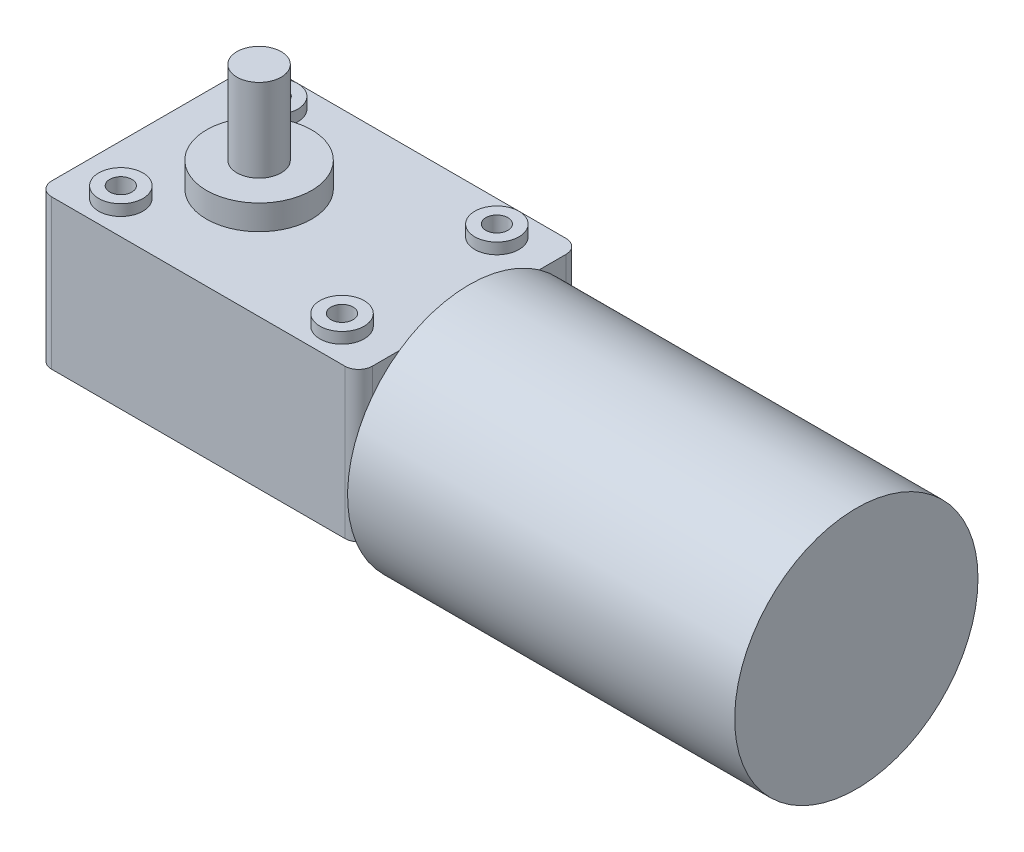
ISO-10303-21;
HEADER;
FILE_DESCRIPTION(('STEP AP214'),'2;1');
FILE_NAME('part.step','',(''),(''),'','','');
FILE_SCHEMA(('AUTOMOTIVE_DESIGN { 1 0 10303 214 1 1 1 1 }'));
ENDSEC;
DATA;
#1=APPLICATION_CONTEXT('core data for automotive mechanical design processes');
#2=APPLICATION_PROTOCOL_DEFINITION('international standard','automotive_design',2000,#1);
#3=PRODUCT_CONTEXT('',#1,'mechanical');
#4=PRODUCT('Part','Part','',(#3));
#5=PRODUCT_RELATED_PRODUCT_CATEGORY('part','',(#4));
#6=PRODUCT_DEFINITION_FORMATION('','',#4);
#7=PRODUCT_DEFINITION_CONTEXT('part definition',#1,'design');
#8=PRODUCT_DEFINITION('design','',#6,#7);
#9=PRODUCT_DEFINITION_SHAPE('','',#8);
#10=(LENGTH_UNIT() NAMED_UNIT(*) SI_UNIT(.MILLI.,.METRE.));
#11=(NAMED_UNIT(*) PLANE_ANGLE_UNIT() SI_UNIT($,.RADIAN.));
#12=(NAMED_UNIT(*) SI_UNIT($,.STERADIAN.) SOLID_ANGLE_UNIT());
#13=UNCERTAINTY_MEASURE_WITH_UNIT(LENGTH_MEASURE(1.E-05),#10,'distance_accuracy_value','');
#14=(GEOMETRIC_REPRESENTATION_CONTEXT(3) GLOBAL_UNCERTAINTY_ASSIGNED_CONTEXT((#13)) GLOBAL_UNIT_ASSIGNED_CONTEXT((#10,
#11,#12)) REPRESENTATION_CONTEXT('',''));
#15=CARTESIAN_POINT('',(0.,0.,0.));
#16=DIRECTION('',(0.,0.,1.));
#17=DIRECTION('',(1.,0.,0.));
#18=AXIS2_PLACEMENT_3D('',#15,#16,#17);
#19=CARTESIAN_POINT('',(-20.,-15.5,14.));
#20=DIRECTION('',(0.,-1.,0.));
#21=DIRECTION('',(0.,0.,1.));
#22=AXIS2_PLACEMENT_3D('',#19,#20,#21);
#23=PLANE('',#22);
#24=CARTESIAN_POINT('',(-20.,-15.5,14.));
#25=DIRECTION('',(0.,1.,0.));
#26=DIRECTION('',(0.,0.,1.));
#27=AXIS2_PLACEMENT_3D('',#24,#25,#26);
#28=CIRCLE('',#27,4.);
#29=CARTESIAN_POINT('',(-20.,-15.5,18.));
#30=VERTEX_POINT('',#29);
#31=EDGE_CURVE('E268',#30,#30,#28,.T.);
#32=ORIENTED_EDGE('',*,*,#31,.F.);
#33=EDGE_LOOP('',(#32));
#34=FACE_BOUND('',#33,.T.);
#35=CARTESIAN_POINT('',(-20.,-15.5,14.));
#36=DIRECTION('',(0.,1.,0.));
#37=DIRECTION('',(0.,0.,1.));
#38=AXIS2_PLACEMENT_3D('',#35,#36,#37);
#39=CIRCLE('',#38,2.);
#40=CARTESIAN_POINT('',(-20.,-15.5,16.));
#41=VERTEX_POINT('',#40);
#42=EDGE_CURVE('E307',#41,#41,#39,.T.);
#43=ORIENTED_EDGE('',*,*,#42,.T.);
#44=EDGE_LOOP('',(#43));
#45=FACE_BOUND('',#44,.T.);
#46=ADVANCED_FACE('F34',(#34,#45),#23,.T.);
#47=CARTESIAN_POINT('',(20.,-15.5,14.));
#48=DIRECTION('',(0.,-1.,0.));
#49=DIRECTION('',(0.,0.,1.));
#50=AXIS2_PLACEMENT_3D('',#47,#48,#49);
#51=PLANE('',#50);
#52=CARTESIAN_POINT('',(20.,-15.5,14.));
#53=DIRECTION('',(0.,1.,0.));
#54=DIRECTION('',(0.,0.,1.));
#55=AXIS2_PLACEMENT_3D('',#52,#53,#54);
#56=CIRCLE('',#55,4.);
#57=CARTESIAN_POINT('',(20.,-15.5,18.));
#58=VERTEX_POINT('',#57);
#59=EDGE_CURVE('E274',#58,#58,#56,.T.);
#60=ORIENTED_EDGE('',*,*,#59,.F.);
#61=EDGE_LOOP('',(#60));
#62=FACE_BOUND('',#61,.T.);
#63=CARTESIAN_POINT('',(20.,-15.5,14.));
#64=DIRECTION('',(0.,1.,0.));
#65=DIRECTION('',(0.,0.,1.));
#66=AXIS2_PLACEMENT_3D('',#63,#64,#65);
#67=CIRCLE('',#66,2.);
#68=CARTESIAN_POINT('',(20.,-15.5,16.));
#69=VERTEX_POINT('',#68);
#70=EDGE_CURVE('E301',#69,#69,#67,.T.);
#71=ORIENTED_EDGE('',*,*,#70,.T.);
#72=EDGE_LOOP('',(#71));
#73=FACE_BOUND('',#72,.T.);
#74=ADVANCED_FACE('F378',(#62,#73),#51,.T.);
#75=CARTESIAN_POINT('',(20.,-15.5,-14.));
#76=DIRECTION('',(0.,-1.,0.));
#77=DIRECTION('',(0.,0.,1.));
#78=AXIS2_PLACEMENT_3D('',#75,#76,#77);
#79=PLANE('',#78);
#80=CARTESIAN_POINT('',(20.,-15.5,-14.));
#81=DIRECTION('',(0.,1.,0.));
#82=DIRECTION('',(0.,0.,1.));
#83=AXIS2_PLACEMENT_3D('',#80,#81,#82);
#84=CIRCLE('',#83,4.);
#85=CARTESIAN_POINT('',(20.,-15.5,-10.));
#86=VERTEX_POINT('',#85);
#87=EDGE_CURVE('E280',#86,#86,#84,.T.);
#88=ORIENTED_EDGE('',*,*,#87,.F.);
#89=EDGE_LOOP('',(#88));
#90=FACE_BOUND('',#89,.T.);
#91=CARTESIAN_POINT('',(20.,-15.5,-14.));
#92=DIRECTION('',(0.,1.,0.));
#93=DIRECTION('',(0.,0.,1.));
#94=AXIS2_PLACEMENT_3D('',#91,#92,#93);
#95=CIRCLE('',#94,2.);
#96=CARTESIAN_POINT('',(20.,-15.5,-12.));
#97=VERTEX_POINT('',#96);
#98=EDGE_CURVE('E295',#97,#97,#95,.T.);
#99=ORIENTED_EDGE('',*,*,#98,.T.);
#100=EDGE_LOOP('',(#99));
#101=FACE_BOUND('',#100,.T.);
#102=ADVANCED_FACE('F384',(#90,#101),#79,.T.);
#103=CARTESIAN_POINT('',(-20.,-15.5,-13.9999999999999));
#104=DIRECTION('',(0.,-1.,0.));
#105=DIRECTION('',(0.,0.,1.));
#106=AXIS2_PLACEMENT_3D('',#103,#104,#105);
#107=PLANE('',#106);
#108=CARTESIAN_POINT('',(-20.,-15.5,-13.9999999999999));
#109=DIRECTION('',(0.,1.,0.));
#110=DIRECTION('',(0.,0.,1.));
#111=AXIS2_PLACEMENT_3D('',#108,#109,#110);
#112=CIRCLE('',#111,4.);
#113=CARTESIAN_POINT('',(-20.,-15.5,-9.9999999999999));
#114=VERTEX_POINT('',#113);
#115=EDGE_CURVE('E267',#114,#114,#112,.T.);
#116=ORIENTED_EDGE('',*,*,#115,.F.);
#117=EDGE_LOOP('',(#116));
#118=FACE_BOUND('',#117,.T.);
#119=CARTESIAN_POINT('',(-20.,-15.5,-13.9999999999999));
#120=DIRECTION('',(0.,1.,0.));
#121=DIRECTION('',(0.,0.,1.));
#122=AXIS2_PLACEMENT_3D('',#119,#120,#121);
#123=CIRCLE('',#122,2.);
#124=CARTESIAN_POINT('',(-20.,-15.5,-11.9999999999999));
#125=VERTEX_POINT('',#124);
#126=EDGE_CURVE('E289',#125,#125,#123,.T.);
#127=ORIENTED_EDGE('',*,*,#126,.T.);
#128=EDGE_LOOP('',(#127));
#129=FACE_BOUND('',#128,.T.);
#130=ADVANCED_FACE('F390',(#118,#129),#107,.T.);
#131=CARTESIAN_POINT('',(29.,13.5,17.5));
#132=DIRECTION('',(-1.,0.,0.));
#133=DIRECTION('',(0.,0.,1.));
#134=AXIS2_PLACEMENT_3D('',#131,#132,#133);
#135=PLANE('',#134);
#136=CARTESIAN_POINT('',(29.,-4.49999999999995,0.));
#137=DIRECTION('',(1.,0.,0.));
#138=DIRECTION('',(0.,0.,-1.));
#139=AXIS2_PLACEMENT_3D('',#136,#137,#138);
#140=CIRCLE('',#139,22.);
#141=CARTESIAN_POINT('',(29.,8.83229162597343,-17.5));
#142=VERTEX_POINT('',#141);
#143=CARTESIAN_POINT('',(29.,13.5,-12.6491106406736));
#144=VERTEX_POINT('',#143);
#145=EDGE_CURVE('E257',#142,#144,#140,.T.);
#146=ORIENTED_EDGE('',*,*,#145,.F.);
#147=DIRECTION('',(0.,-1.,0.));
#148=VECTOR('',#147,1.);
#149=CARTESIAN_POINT('',(29.,13.5,-17.5));
#150=LINE('',#149,#148);
#151=CARTESIAN_POINT('',(29.,13.5,-17.5));
#152=VERTEX_POINT('',#151);
#153=EDGE_CURVE('E130',#152,#142,#150,.T.);
#154=ORIENTED_EDGE('',*,*,#153,.F.);
#155=DIRECTION('',(0.,0.,-1.));
#156=VECTOR('',#155,1.);
#157=CARTESIAN_POINT('',(29.,13.5,17.5));
#158=LINE('',#157,#156);
#159=EDGE_CURVE('E57',#144,#152,#158,.T.);
#160=ORIENTED_EDGE('',*,*,#159,.F.);
#161=EDGE_LOOP('',(#146,#154,#160));
#162=FACE_BOUND('',#161,.T.);
#163=ADVANCED_FACE('F392',(#162),#135,.F.);
#164=CARTESIAN_POINT('',(29.,13.5,12.6491106406736));
#165=VERTEX_POINT('',#164);
#166=CARTESIAN_POINT('',(29.,8.83229162597343,17.5));
#167=VERTEX_POINT('',#166);
#168=EDGE_CURVE('E870',#165,#167,#140,.T.);
#169=ORIENTED_EDGE('',*,*,#168,.F.);
#170=CARTESIAN_POINT('',(29.,13.5,17.5));
#171=VERTEX_POINT('',#170);
#172=EDGE_CURVE('E192',#171,#165,#158,.T.);
#173=ORIENTED_EDGE('',*,*,#172,.F.);
#174=DIRECTION('',(0.,-1.,0.));
#175=VECTOR('',#174,1.);
#176=CARTESIAN_POINT('',(29.,13.5,17.5));
#177=LINE('',#176,#175);
#178=EDGE_CURVE('E162',#171,#167,#177,.T.);
#179=ORIENTED_EDGE('',*,*,#178,.T.);
#180=EDGE_LOOP('',(#169,#173,#179));
#181=FACE_BOUND('',#180,.T.);
#182=ADVANCED_FACE('F398',(#181),#135,.F.);
#183=CARTESIAN_POINT('',(-9.00000000000001,18.,0.));
#184=DIRECTION('',(0.,1.,0.));
#185=DIRECTION('',(0.,0.,1.));
#186=AXIS2_PLACEMENT_3D('',#183,#184,#185);
#187=PLANE('',#186);
#188=CARTESIAN_POINT('',(-9.00000000000001,18.,0.));
#189=DIRECTION('',(0.,1.,0.));
#190=DIRECTION('',(0.,0.,1.));
#191=AXIS2_PLACEMENT_3D('',#188,#189,#190);
#192=CIRCLE('',#191,9.5);
#193=CARTESIAN_POINT('',(-9.00000000000001,18.,9.5));
#194=VERTEX_POINT('',#193);
#195=EDGE_CURVE('E240',#194,#194,#192,.T.);
#196=ORIENTED_EDGE('',*,*,#195,.T.);
#197=EDGE_LOOP('',(#196));
#198=FACE_BOUND('',#197,.T.);
#199=CARTESIAN_POINT('',(-9.00000000000001,18.,0.));
#200=DIRECTION('',(0.,1.,0.));
#201=DIRECTION('',(0.,0.,1.));
#202=AXIS2_PLACEMENT_3D('',#199,#200,#201);
#203=CIRCLE('',#202,4.);
#204=CARTESIAN_POINT('',(-9.00000000000001,18.,4.));
#205=VERTEX_POINT('',#204);
#206=EDGE_CURVE('E249',#205,#205,#203,.T.);
#207=ORIENTED_EDGE('',*,*,#206,.F.);
#208=EDGE_LOOP('',(#207));
#209=FACE_BOUND('',#208,.T.);
#210=ADVANCED_FACE('F610',(#198,#209),#187,.T.);
#211=CARTESIAN_POINT('',(-26.5,13.5,17.5));
#212=DIRECTION('',(0.,1.,0.));
#213=DIRECTION('',(0.,0.,1.));
#214=AXIS2_PLACEMENT_3D('',#211,#212,#213);
#215=PLANE('',#214);
#216=CARTESIAN_POINT('',(20.,13.5,-14.));
#217=DIRECTION('',(0.,1.,0.));
#218=DIRECTION('',(0.,0.,1.));
#219=AXIS2_PLACEMENT_3D('',#216,#217,#218);
#220=CIRCLE('',#219,4.);
#221=CARTESIAN_POINT('',(20.,13.5,-10.));
#222=VERTEX_POINT('',#221);
#223=EDGE_CURVE('E213',#222,#222,#220,.T.);
#224=ORIENTED_EDGE('',*,*,#223,.F.);
#225=EDGE_LOOP('',(#224));
#226=FACE_BOUND('',#225,.T.);
#227=CARTESIAN_POINT('',(-20.,13.5,14.));
#228=DIRECTION('',(0.,1.,0.));
#229=DIRECTION('',(0.,0.,1.));
#230=AXIS2_PLACEMENT_3D('',#227,#228,#229);
#231=CIRCLE('',#230,4.);
#232=CARTESIAN_POINT('',(-20.,13.5,18.));
#233=VERTEX_POINT('',#232);
#234=EDGE_CURVE('E201',#233,#233,#231,.T.);
#235=ORIENTED_EDGE('',*,*,#234,.F.);
#236=EDGE_LOOP('',(#235));
#237=FACE_BOUND('',#236,.T.);
#238=CARTESIAN_POINT('',(-26.5,13.5,17.5));
#239=DIRECTION('',(0.,1.,0.));
#240=DIRECTION('',(0.,0.,1.));
#241=AXIS2_PLACEMENT_3D('',#238,#239,#240);
#242=CIRCLE('',#241,2.5);
#243=CARTESIAN_POINT('',(-29.,13.5,17.5));
#244=VERTEX_POINT('',#243);
#245=CARTESIAN_POINT('',(-26.5,13.5,20.));
#246=VERTEX_POINT('',#245);
#247=EDGE_CURVE('E148',#244,#246,#242,.T.);
#248=ORIENTED_EDGE('',*,*,#247,.T.);
#249=DIRECTION('',(1.,0.,0.));
#250=VECTOR('',#249,1.);
#251=CARTESIAN_POINT('',(-26.5,13.5,20.));
#252=LINE('',#251,#250);
#253=CARTESIAN_POINT('',(26.5,13.5,20.));
#254=VERTEX_POINT('',#253);
#255=EDGE_CURVE('E174',#246,#254,#252,.T.);
#256=ORIENTED_EDGE('',*,*,#255,.T.);
#257=CARTESIAN_POINT('',(26.5,13.5,17.5));
#258=DIRECTION('',(0.,1.,0.));
#259=DIRECTION('',(0.,0.,1.));
#260=AXIS2_PLACEMENT_3D('',#257,#258,#259);
#261=CIRCLE('',#260,2.5);
#262=EDGE_CURVE('E167',#254,#171,#261,.T.);
#263=ORIENTED_EDGE('',*,*,#262,.T.);
#264=ORIENTED_EDGE('',*,*,#172,.T.);
#265=DIRECTION('',(0.,0.,-1.));
#266=VECTOR('',#265,1.);
#267=CARTESIAN_POINT('',(29.,13.5,17.5));
#268=LINE('',#267,#266);
#269=EDGE_CURVE('E252',#165,#144,#268,.T.);
#270=ORIENTED_EDGE('',*,*,#269,.T.);
#271=ORIENTED_EDGE('',*,*,#159,.T.);
#272=CARTESIAN_POINT('',(26.5,13.5,-17.5));
#273=DIRECTION('',(0.,1.,0.));
#274=DIRECTION('',(0.,0.,1.));
#275=AXIS2_PLACEMENT_3D('',#272,#273,#274);
#276=CIRCLE('',#275,2.49999999999999);
#277=CARTESIAN_POINT('',(26.5,13.5,-20.));
#278=VERTEX_POINT('',#277);
#279=EDGE_CURVE('E190',#152,#278,#276,.T.);
#280=ORIENTED_EDGE('',*,*,#279,.T.);
#281=DIRECTION('',(-1.,0.,0.));
#282=VECTOR('',#281,1.);
#283=CARTESIAN_POINT('',(-26.5,13.5,-20.));
#284=LINE('',#283,#282);
#285=CARTESIAN_POINT('',(-26.5,13.5,-20.));
#286=VERTEX_POINT('',#285);
#287=EDGE_CURVE('E188',#278,#286,#284,.T.);
#288=ORIENTED_EDGE('',*,*,#287,.T.);
#289=CARTESIAN_POINT('',(-26.5,13.5,-17.5));
#290=DIRECTION('',(0.,1.,0.));
#291=DIRECTION('',(0.,0.,-1.));
#292=AXIS2_PLACEMENT_3D('',#289,#290,#291);
#293=CIRCLE('',#292,2.5);
#294=CARTESIAN_POINT('',(-29.,13.5,-17.5));
#295=VERTEX_POINT('',#294);
#296=EDGE_CURVE('E186',#286,#295,#293,.T.);
#297=ORIENTED_EDGE('',*,*,#296,.T.);
#298=DIRECTION('',(0.,0.,1.));
#299=VECTOR('',#298,1.);
#300=CARTESIAN_POINT('',(-29.,13.5,17.5));
#301=LINE('',#300,#299);
#302=EDGE_CURVE('E153',#295,#244,#301,.T.);
#303=ORIENTED_EDGE('',*,*,#302,.T.);
#304=EDGE_LOOP('',(#248,#256,#263,#264,#270,#271,#280,#288,#297,#303));
#305=FACE_BOUND('',#304,.T.);
#306=CARTESIAN_POINT('',(-20.,13.5,-13.9999999999999));
#307=DIRECTION('',(0.,1.,0.));
#308=DIRECTION('',(0.,0.,1.));
#309=AXIS2_PLACEMENT_3D('',#306,#307,#308);
#310=CIRCLE('',#309,4.);
#311=CARTESIAN_POINT('',(-20.,13.5,-9.9999999999999));
#312=VERTEX_POINT('',#311);
#313=EDGE_CURVE('E182',#312,#312,#310,.T.);
#314=ORIENTED_EDGE('',*,*,#313,.F.);
#315=EDGE_LOOP('',(#314));
#316=FACE_BOUND('',#315,.T.);
#317=CARTESIAN_POINT('',(20.,13.5,14.));
#318=DIRECTION('',(0.,1.,0.));
#319=DIRECTION('',(0.,0.,1.));
#320=AXIS2_PLACEMENT_3D('',#317,#318,#319);
#321=CIRCLE('',#320,4.);
#322=CARTESIAN_POINT('',(20.,13.5,18.));
#323=VERTEX_POINT('',#322);
#324=EDGE_CURVE('E207',#323,#323,#321,.T.);
#325=ORIENTED_EDGE('',*,*,#324,.F.);
#326=EDGE_LOOP('',(#325));
#327=FACE_BOUND('',#326,.T.);
#328=CARTESIAN_POINT('',(-9.00000000000001,13.5,0.));
#329=DIRECTION('',(0.,1.,0.));
#330=DIRECTION('',(0.,0.,1.));
#331=AXIS2_PLACEMENT_3D('',#328,#329,#330);
#332=CIRCLE('',#331,9.5);
#333=CARTESIAN_POINT('',(-9.00000000000001,13.5,9.5));
#334=VERTEX_POINT('',#333);
#335=EDGE_CURVE('E243',#334,#334,#332,.T.);
#336=ORIENTED_EDGE('',*,*,#335,.F.);
#337=EDGE_LOOP('',(#336));
#338=FACE_BOUND('',#337,.T.);
#339=ADVANCED_FACE('F605',(#226,#237,#305,#316,#327,#338),#215,.T.);
#340=CARTESIAN_POINT('',(-26.5,13.5,17.5));
#341=DIRECTION('',(0.,-1.,0.));
#342=DIRECTION('',(0.,0.,-1.));
#343=AXIS2_PLACEMENT_3D('',#340,#341,#342);
#344=CYLINDRICAL_SURFACE('',#343,2.5);
#345=CARTESIAN_POINT('',(-26.5,-13.5,17.5));
#346=DIRECTION('',(0.,1.,0.));
#347=DIRECTION('',(0.,0.,1.));
#348=AXIS2_PLACEMENT_3D('',#345,#346,#347);
#349=CIRCLE('',#348,2.5);
#350=CARTESIAN_POINT('',(-29.,-13.5,17.5));
#351=VERTEX_POINT('',#350);
#352=CARTESIAN_POINT('',(-26.5,-13.5,20.));
#353=VERTEX_POINT('',#352);
#354=EDGE_CURVE('E171',#351,#353,#349,.T.);
#355=ORIENTED_EDGE('',*,*,#354,.T.);
#356=DIRECTION('',(0.,-1.,0.));
#357=VECTOR('',#356,1.);
#358=CARTESIAN_POINT('',(-26.5,13.5,20.));
#359=LINE('',#358,#357);
#360=EDGE_CURVE('E11',#246,#353,#359,.T.);
#361=ORIENTED_EDGE('',*,*,#360,.F.);
#362=ORIENTED_EDGE('',*,*,#247,.F.);
#363=DIRECTION('',(0.,-1.,0.));
#364=VECTOR('',#363,1.);
#365=CARTESIAN_POINT('',(-29.,13.5,17.5));
#366=LINE('',#365,#364);
#367=EDGE_CURVE('E149',#244,#351,#366,.T.);
#368=ORIENTED_EDGE('',*,*,#367,.T.);
#369=EDGE_LOOP('',(#355,#361,#362,#368));
#370=FACE_BOUND('',#369,.T.);
#371=ADVANCED_FACE('F36',(#370),#344,.T.);
#372=CARTESIAN_POINT('',(-26.5,13.5,20.));
#373=DIRECTION('',(0.,0.,-1.));
#374=DIRECTION('',(-1.,0.,0.));
#375=AXIS2_PLACEMENT_3D('',#372,#373,#374);
#376=PLANE('',#375);
#377=DIRECTION('',(1.,0.,0.));
#378=VECTOR('',#377,1.);
#379=CARTESIAN_POINT('',(-26.5,-13.5,20.));
#380=LINE('',#379,#378);
#381=CARTESIAN_POINT('',(26.5,-13.5,20.));
#382=VERTEX_POINT('',#381);
#383=EDGE_CURVE('E139',#353,#382,#380,.T.);
#384=ORIENTED_EDGE('',*,*,#383,.T.);
#385=DIRECTION('',(0.,-1.,0.));
#386=VECTOR('',#385,1.);
#387=CARTESIAN_POINT('',(26.5,13.5,20.));
#388=LINE('',#387,#386);
#389=EDGE_CURVE('E42',#254,#382,#388,.T.);
#390=ORIENTED_EDGE('',*,*,#389,.F.);
#391=ORIENTED_EDGE('',*,*,#255,.F.);
#392=ORIENTED_EDGE('',*,*,#360,.T.);
#393=EDGE_LOOP('',(#384,#390,#391,#392));
#394=FACE_BOUND('',#393,.T.);
#395=ADVANCED_FACE('F173',(#394),#376,.F.);
#396=CARTESIAN_POINT('',(26.5,13.5,17.5));
#397=DIRECTION('',(0.,-1.,0.));
#398=DIRECTION('',(0.,0.,-1.));
#399=AXIS2_PLACEMENT_3D('',#396,#397,#398);
#400=CYLINDRICAL_SURFACE('',#399,2.5);
#401=CARTESIAN_POINT('',(26.5,-13.5,17.5));
#402=DIRECTION('',(0.,1.,0.));
#403=DIRECTION('',(0.,0.,1.));
#404=AXIS2_PLACEMENT_3D('',#401,#402,#403);
#405=CIRCLE('',#404,2.5);
#406=CARTESIAN_POINT('',(29.,-13.5,17.5));
#407=VERTEX_POINT('',#406);
#408=EDGE_CURVE('E137',#382,#407,#405,.T.);
#409=ORIENTED_EDGE('',*,*,#408,.T.);
#410=DIRECTION('',(0.,-1.,0.));
#411=VECTOR('',#410,1.);
#412=CARTESIAN_POINT('',(29.,13.5,17.5));
#413=LINE('',#412,#411);
#414=EDGE_CURVE('E49',#167,#407,#413,.T.);
#415=ORIENTED_EDGE('',*,*,#414,.F.);
#416=ORIENTED_EDGE('',*,*,#178,.F.);
#417=ORIENTED_EDGE('',*,*,#262,.F.);
#418=ORIENTED_EDGE('',*,*,#389,.T.);
#419=EDGE_LOOP('',(#409,#415,#416,#417,#418));
#420=FACE_BOUND('',#419,.T.);
#421=ADVANCED_FACE('F166',(#420),#400,.T.);
#422=CARTESIAN_POINT('',(26.5,13.5,-17.5));
#423=DIRECTION('',(0.,-1.,0.));
#424=DIRECTION('',(0.,0.,-1.));
#425=AXIS2_PLACEMENT_3D('',#422,#423,#424);
#426=CYLINDRICAL_SURFACE('',#425,2.49999999999999);
#427=CARTESIAN_POINT('',(26.5,-13.5,-17.5));
#428=DIRECTION('',(0.,1.,0.));
#429=DIRECTION('',(0.,0.,1.));
#430=AXIS2_PLACEMENT_3D('',#427,#428,#429);
#431=CIRCLE('',#430,2.49999999999999);
#432=CARTESIAN_POINT('',(29.,-13.5,-17.5));
#433=VERTEX_POINT('',#432);
#434=CARTESIAN_POINT('',(26.5,-13.5,-20.));
#435=VERTEX_POINT('',#434);
#436=EDGE_CURVE('E112',#433,#435,#431,.T.);
#437=ORIENTED_EDGE('',*,*,#436,.T.);
#438=DIRECTION('',(0.,-1.,0.));
#439=VECTOR('',#438,1.);
#440=CARTESIAN_POINT('',(26.5,13.5,-20.));
#441=LINE('',#440,#439);
#442=EDGE_CURVE('E159',#278,#435,#441,.T.);
#443=ORIENTED_EDGE('',*,*,#442,.F.);
#444=ORIENTED_EDGE('',*,*,#279,.F.);
#445=ORIENTED_EDGE('',*,*,#153,.T.);
#446=DIRECTION('',(0.,-1.,0.));
#447=VECTOR('',#446,1.);
#448=CARTESIAN_POINT('',(29.,13.5,-17.5));
#449=LINE('',#448,#447);
#450=EDGE_CURVE('E127',#142,#433,#449,.T.);
#451=ORIENTED_EDGE('',*,*,#450,.T.);
#452=EDGE_LOOP('',(#437,#443,#444,#445,#451));
#453=FACE_BOUND('',#452,.T.);
#454=ADVANCED_FACE('F128',(#453),#426,.T.);
#455=CARTESIAN_POINT('',(-26.5,13.5,-20.));
#456=DIRECTION('',(0.,0.,1.));
#457=DIRECTION('',(1.,0.,0.));
#458=AXIS2_PLACEMENT_3D('',#455,#456,#457);
#459=PLANE('',#458);
#460=DIRECTION('',(-1.,0.,0.));
#461=VECTOR('',#460,1.);
#462=CARTESIAN_POINT('',(-26.5,-13.5,-20.));
#463=LINE('',#462,#461);
#464=CARTESIAN_POINT('',(-26.5,-13.5,-20.));
#465=VERTEX_POINT('',#464);
#466=EDGE_CURVE('E120',#435,#465,#463,.T.);
#467=ORIENTED_EDGE('',*,*,#466,.T.);
#468=DIRECTION('',(0.,-1.,0.));
#469=VECTOR('',#468,1.);
#470=CARTESIAN_POINT('',(-26.5,13.5,-20.));
#471=LINE('',#470,#469);
#472=EDGE_CURVE('E156',#286,#465,#471,.T.);
#473=ORIENTED_EDGE('',*,*,#472,.F.);
#474=ORIENTED_EDGE('',*,*,#287,.F.);
#475=ORIENTED_EDGE('',*,*,#442,.T.);
#476=EDGE_LOOP('',(#467,#473,#474,#475));
#477=FACE_BOUND('',#476,.T.);
#478=ADVANCED_FACE('F588',(#477),#459,.F.);
#479=CARTESIAN_POINT('',(-26.5,13.5,-17.5));
#480=DIRECTION('',(0.,-1.,0.));
#481=DIRECTION('',(0.,0.,-1.));
#482=AXIS2_PLACEMENT_3D('',#479,#480,#481);
#483=CYLINDRICAL_SURFACE('',#482,2.5);
#484=CARTESIAN_POINT('',(-26.5,-13.5,-17.5));
#485=DIRECTION('',(0.,1.,0.));
#486=DIRECTION('',(0.,0.,-1.));
#487=AXIS2_PLACEMENT_3D('',#484,#485,#486);
#488=CIRCLE('',#487,2.5);
#489=CARTESIAN_POINT('',(-29.,-13.5,-17.5));
#490=VERTEX_POINT('',#489);
#491=EDGE_CURVE('E144',#465,#490,#488,.T.);
#492=ORIENTED_EDGE('',*,*,#491,.T.);
#493=DIRECTION('',(0.,-1.,0.));
#494=VECTOR('',#493,1.);
#495=CARTESIAN_POINT('',(-29.,13.5,-17.5));
#496=LINE('',#495,#494);
#497=EDGE_CURVE('E152',#295,#490,#496,.T.);
#498=ORIENTED_EDGE('',*,*,#497,.F.);
#499=ORIENTED_EDGE('',*,*,#296,.F.);
#500=ORIENTED_EDGE('',*,*,#472,.T.);
#501=EDGE_LOOP('',(#492,#498,#499,#500));
#502=FACE_BOUND('',#501,.T.);
#503=ADVANCED_FACE('F826',(#502),#483,.T.);
#504=CARTESIAN_POINT('',(-29.,13.5,17.5));
#505=DIRECTION('',(1.,0.,0.));
#506=DIRECTION('',(0.,0.,-1.));
#507=AXIS2_PLACEMENT_3D('',#504,#505,#506);
#508=PLANE('',#507);
#509=DIRECTION('',(0.,0.,1.));
#510=VECTOR('',#509,1.);
#511=CARTESIAN_POINT('',(-29.,-13.5,17.5));
#512=LINE('',#511,#510);
#513=EDGE_CURVE('E146',#490,#351,#512,.T.);
#514=ORIENTED_EDGE('',*,*,#513,.T.);
#515=ORIENTED_EDGE('',*,*,#367,.F.);
#516=ORIENTED_EDGE('',*,*,#302,.F.);
#517=ORIENTED_EDGE('',*,*,#497,.T.);
#518=EDGE_LOOP('',(#514,#515,#516,#517));
#519=FACE_BOUND('',#518,.T.);
#520=ADVANCED_FACE('F349',(#519),#508,.F.);
#521=CARTESIAN_POINT('',(-26.5,-13.5,17.5));
#522=DIRECTION('',(0.,1.,0.));
#523=DIRECTION('',(0.,0.,1.));
#524=AXIS2_PLACEMENT_3D('',#521,#522,#523);
#525=PLANE('',#524);
#526=CARTESIAN_POINT('',(-9.00000000000001,-13.5,0.));
#527=DIRECTION('',(0.,1.,0.));
#528=DIRECTION('',(0.,0.,1.));
#529=AXIS2_PLACEMENT_3D('',#526,#527,#528);
#530=CIRCLE('',#529,9.5);
#531=CARTESIAN_POINT('',(-9.00000000000001,-13.5,9.5));
#532=VERTEX_POINT('',#531);
#533=EDGE_CURVE('E313',#532,#532,#530,.T.);
#534=ORIENTED_EDGE('',*,*,#533,.T.);
#535=EDGE_LOOP('',(#534));
#536=FACE_BOUND('',#535,.T.);
#537=CARTESIAN_POINT('',(20.,-13.5,-14.));
#538=DIRECTION('',(0.,1.,0.));
#539=DIRECTION('',(0.,0.,1.));
#540=AXIS2_PLACEMENT_3D('',#537,#538,#539);
#541=CIRCLE('',#540,4.);
#542=CARTESIAN_POINT('',(20.,-13.5,-10.));
#543=VERTEX_POINT('',#542);
#544=EDGE_CURVE('E283',#543,#543,#541,.T.);
#545=ORIENTED_EDGE('',*,*,#544,.T.);
#546=EDGE_LOOP('',(#545));
#547=FACE_BOUND('',#546,.T.);
#548=CARTESIAN_POINT('',(20.,-13.5,14.));
#549=DIRECTION('',(0.,1.,0.));
#550=DIRECTION('',(0.,0.,1.));
#551=AXIS2_PLACEMENT_3D('',#548,#549,#550);
#552=CIRCLE('',#551,4.);
#553=CARTESIAN_POINT('',(20.,-13.5,18.));
#554=VERTEX_POINT('',#553);
#555=EDGE_CURVE('E277',#554,#554,#552,.T.);
#556=ORIENTED_EDGE('',*,*,#555,.T.);
#557=EDGE_LOOP('',(#556));
#558=FACE_BOUND('',#557,.T.);
#559=CARTESIAN_POINT('',(-20.,-13.5,14.));
#560=DIRECTION('',(0.,1.,0.));
#561=DIRECTION('',(0.,0.,1.));
#562=AXIS2_PLACEMENT_3D('',#559,#560,#561);
#563=CIRCLE('',#562,4.);
#564=CARTESIAN_POINT('',(-20.,-13.5,18.));
#565=VERTEX_POINT('',#564);
#566=EDGE_CURVE('E271',#565,#565,#563,.T.);
#567=ORIENTED_EDGE('',*,*,#566,.T.);
#568=EDGE_LOOP('',(#567));
#569=FACE_BOUND('',#568,.T.);
#570=CARTESIAN_POINT('',(-20.,-13.5,-13.9999999999999));
#571=DIRECTION('',(0.,1.,0.));
#572=DIRECTION('',(0.,0.,1.));
#573=AXIS2_PLACEMENT_3D('',#570,#571,#572);
#574=CIRCLE('',#573,4.);
#575=CARTESIAN_POINT('',(-20.,-13.5,-9.9999999999999));
#576=VERTEX_POINT('',#575);
#577=EDGE_CURVE('E264',#576,#576,#574,.T.);
#578=ORIENTED_EDGE('',*,*,#577,.T.);
#579=EDGE_LOOP('',(#578));
#580=FACE_BOUND('',#579,.T.);
#581=ORIENTED_EDGE('',*,*,#354,.F.);
#582=ORIENTED_EDGE('',*,*,#513,.F.);
#583=ORIENTED_EDGE('',*,*,#491,.F.);
#584=ORIENTED_EDGE('',*,*,#466,.F.);
#585=ORIENTED_EDGE('',*,*,#436,.F.);
#586=DIRECTION('',(0.,0.,-1.));
#587=VECTOR('',#586,1.);
#588=CARTESIAN_POINT('',(29.,-13.5,17.5));
#589=LINE('',#588,#587);
#590=EDGE_CURVE('E118',#407,#433,#589,.T.);
#591=ORIENTED_EDGE('',*,*,#590,.F.);
#592=ORIENTED_EDGE('',*,*,#408,.F.);
#593=ORIENTED_EDGE('',*,*,#383,.F.);
#594=EDGE_LOOP('',(#581,#582,#583,#584,#585,#591,#592,#593));
#595=FACE_BOUND('',#594,.T.);
#596=ADVANCED_FACE('F115',(#536,#547,#558,#569,#580,#595),#525,.F.);
#597=CARTESIAN_POINT('',(-20.,15.5,-13.9999999999999));
#598=DIRECTION('',(0.,-1.,0.));
#599=DIRECTION('',(0.,0.,-1.));
#600=AXIS2_PLACEMENT_3D('',#597,#598,#599);
#601=CYLINDRICAL_SURFACE('',#600,4.);
#602=CARTESIAN_POINT('',(-20.,15.5,-13.9999999999999));
#603=DIRECTION('',(0.,1.,0.));
#604=DIRECTION('',(0.,0.,1.));
#605=AXIS2_PLACEMENT_3D('',#602,#603,#604);
#606=CIRCLE('',#605,4.);
#607=CARTESIAN_POINT('',(-20.,15.5,-9.9999999999999));
#608=VERTEX_POINT('',#607);
#609=EDGE_CURVE('E179',#608,#608,#606,.T.);
#610=ORIENTED_EDGE('',*,*,#609,.F.);
#611=EDGE_LOOP('',(#610));
#612=FACE_BOUND('',#611,.T.);
#613=ORIENTED_EDGE('',*,*,#313,.T.);
#614=EDGE_LOOP('',(#613));
#615=FACE_BOUND('',#614,.T.);
#616=ADVANCED_FACE('F348',(#612,#615),#601,.T.);
#617=CARTESIAN_POINT('',(-20.,15.5,-13.9999999999999));
#618=DIRECTION('',(0.,1.,0.));
#619=DIRECTION('',(0.,0.,1.));
#620=AXIS2_PLACEMENT_3D('',#617,#618,#619);
#621=PLANE('',#620);
#622=CARTESIAN_POINT('',(-20.,15.5,-13.9999999999999));
#623=DIRECTION('',(0.,1.,0.));
#624=DIRECTION('',(0.,0.,1.));
#625=AXIS2_PLACEMENT_3D('',#622,#623,#624);
#626=CIRCLE('',#625,2.);
#627=CARTESIAN_POINT('',(-20.,15.5,-11.9999999999999));
#628=VERTEX_POINT('',#627);
#629=EDGE_CURVE('E219',#628,#628,#626,.T.);
#630=ORIENTED_EDGE('',*,*,#629,.F.);
#631=EDGE_LOOP('',(#630));
#632=FACE_BOUND('',#631,.T.);
#633=ORIENTED_EDGE('',*,*,#609,.T.);
#634=EDGE_LOOP('',(#633));
#635=FACE_BOUND('',#634,.T.);
#636=ADVANCED_FACE('F786',(#632,#635),#621,.T.);
#637=CARTESIAN_POINT('',(-20.,15.5,14.));
#638=DIRECTION('',(0.,-1.,0.));
#639=DIRECTION('',(0.,0.,-1.));
#640=AXIS2_PLACEMENT_3D('',#637,#638,#639);
#641=CYLINDRICAL_SURFACE('',#640,4.);
#642=CARTESIAN_POINT('',(-20.,15.5,14.));
#643=DIRECTION('',(0.,1.,0.));
#644=DIRECTION('',(0.,0.,1.));
#645=AXIS2_PLACEMENT_3D('',#642,#643,#644);
#646=CIRCLE('',#645,4.);
#647=CARTESIAN_POINT('',(-20.,15.5,18.));
#648=VERTEX_POINT('',#647);
#649=EDGE_CURVE('E199',#648,#648,#646,.T.);
#650=ORIENTED_EDGE('',*,*,#649,.F.);
#651=EDGE_LOOP('',(#650));
#652=FACE_BOUND('',#651,.T.);
#653=ORIENTED_EDGE('',*,*,#234,.T.);
#654=EDGE_LOOP('',(#653));
#655=FACE_BOUND('',#654,.T.);
#656=ADVANCED_FACE('F778',(#652,#655),#641,.T.);
#657=CARTESIAN_POINT('',(-20.,15.5,14.));
#658=DIRECTION('',(0.,1.,0.));
#659=DIRECTION('',(0.,0.,1.));
#660=AXIS2_PLACEMENT_3D('',#657,#658,#659);
#661=PLANE('',#660);
#662=CARTESIAN_POINT('',(-20.,15.5,14.));
#663=DIRECTION('',(0.,1.,0.));
#664=DIRECTION('',(0.,0.,1.));
#665=AXIS2_PLACEMENT_3D('',#662,#663,#664);
#666=CIRCLE('',#665,2.);
#667=CARTESIAN_POINT('',(-20.,15.5,16.));
#668=VERTEX_POINT('',#667);
#669=EDGE_CURVE('E237',#668,#668,#666,.T.);
#670=ORIENTED_EDGE('',*,*,#669,.F.);
#671=EDGE_LOOP('',(#670));
#672=FACE_BOUND('',#671,.T.);
#673=ORIENTED_EDGE('',*,*,#649,.T.);
#674=EDGE_LOOP('',(#673));
#675=FACE_BOUND('',#674,.T.);
#676=ADVANCED_FACE('F773',(#672,#675),#661,.T.);
#677=CARTESIAN_POINT('',(20.,15.5,14.));
#678=DIRECTION('',(0.,-1.,0.));
#679=DIRECTION('',(0.,0.,-1.));
#680=AXIS2_PLACEMENT_3D('',#677,#678,#679);
#681=CYLINDRICAL_SURFACE('',#680,4.);
#682=CARTESIAN_POINT('',(20.,15.5,14.));
#683=DIRECTION('',(0.,1.,0.));
#684=DIRECTION('',(0.,0.,1.));
#685=AXIS2_PLACEMENT_3D('',#682,#683,#684);
#686=CIRCLE('',#685,4.);
#687=CARTESIAN_POINT('',(20.,15.5,18.));
#688=VERTEX_POINT('',#687);
#689=EDGE_CURVE('E204',#688,#688,#686,.T.);
#690=ORIENTED_EDGE('',*,*,#689,.F.);
#691=EDGE_LOOP('',(#690));
#692=FACE_BOUND('',#691,.T.);
#693=ORIENTED_EDGE('',*,*,#324,.T.);
#694=EDGE_LOOP('',(#693));
#695=FACE_BOUND('',#694,.T.);
#696=ADVANCED_FACE('F765',(#692,#695),#681,.T.);
#697=CARTESIAN_POINT('',(20.,15.5,14.));
#698=DIRECTION('',(0.,1.,0.));
#699=DIRECTION('',(0.,0.,1.));
#700=AXIS2_PLACEMENT_3D('',#697,#698,#699);
#701=PLANE('',#700);
#702=CARTESIAN_POINT('',(20.,15.5,14.));
#703=DIRECTION('',(0.,1.,0.));
#704=DIRECTION('',(0.,0.,1.));
#705=AXIS2_PLACEMENT_3D('',#702,#703,#704);
#706=CIRCLE('',#705,2.);
#707=CARTESIAN_POINT('',(20.,15.5,16.));
#708=VERTEX_POINT('',#707);
#709=EDGE_CURVE('E231',#708,#708,#706,.T.);
#710=ORIENTED_EDGE('',*,*,#709,.F.);
#711=EDGE_LOOP('',(#710));
#712=FACE_BOUND('',#711,.T.);
#713=ORIENTED_EDGE('',*,*,#689,.T.);
#714=EDGE_LOOP('',(#713));
#715=FACE_BOUND('',#714,.T.);
#716=ADVANCED_FACE('F760',(#712,#715),#701,.T.);
#717=CARTESIAN_POINT('',(20.,15.5,-14.));
#718=DIRECTION('',(0.,-1.,0.));
#719=DIRECTION('',(0.,0.,-1.));
#720=AXIS2_PLACEMENT_3D('',#717,#718,#719);
#721=CYLINDRICAL_SURFACE('',#720,4.);
#722=CARTESIAN_POINT('',(20.,15.5,-14.));
#723=DIRECTION('',(0.,1.,0.));
#724=DIRECTION('',(0.,0.,1.));
#725=AXIS2_PLACEMENT_3D('',#722,#723,#724);
#726=CIRCLE('',#725,4.);
#727=CARTESIAN_POINT('',(20.,15.5,-10.));
#728=VERTEX_POINT('',#727);
#729=EDGE_CURVE('E210',#728,#728,#726,.T.);
#730=ORIENTED_EDGE('',*,*,#729,.F.);
#731=EDGE_LOOP('',(#730));
#732=FACE_BOUND('',#731,.T.);
#733=ORIENTED_EDGE('',*,*,#223,.T.);
#734=EDGE_LOOP('',(#733));
#735=FACE_BOUND('',#734,.T.);
#736=ADVANCED_FACE('F752',(#732,#735),#721,.T.);
#737=CARTESIAN_POINT('',(20.,15.5,-14.));
#738=DIRECTION('',(0.,1.,0.));
#739=DIRECTION('',(0.,0.,1.));
#740=AXIS2_PLACEMENT_3D('',#737,#738,#739);
#741=PLANE('',#740);
#742=CARTESIAN_POINT('',(20.,15.5,-14.));
#743=DIRECTION('',(0.,1.,0.));
#744=DIRECTION('',(0.,0.,1.));
#745=AXIS2_PLACEMENT_3D('',#742,#743,#744);
#746=CIRCLE('',#745,2.);
#747=CARTESIAN_POINT('',(20.,15.5,-12.));
#748=VERTEX_POINT('',#747);
#749=EDGE_CURVE('E225',#748,#748,#746,.T.);
#750=ORIENTED_EDGE('',*,*,#749,.F.);
#751=EDGE_LOOP('',(#750));
#752=FACE_BOUND('',#751,.T.);
#753=ORIENTED_EDGE('',*,*,#729,.T.);
#754=EDGE_LOOP('',(#753));
#755=FACE_BOUND('',#754,.T.);
#756=ADVANCED_FACE('F742',(#752,#755),#741,.T.);
#757=CARTESIAN_POINT('',(-20.,9.5,-13.9999999999999));
#758=DIRECTION('',(0.,1.,0.));
#759=DIRECTION('',(0.,0.,1.));
#760=AXIS2_PLACEMENT_3D('',#757,#758,#759);
#761=CYLINDRICAL_SURFACE('',#760,2.);
#762=CARTESIAN_POINT('',(-20.,9.5,-13.9999999999999));
#763=DIRECTION('',(0.,1.,0.));
#764=DIRECTION('',(0.,0.,1.));
#765=AXIS2_PLACEMENT_3D('',#762,#763,#764);
#766=CIRCLE('',#765,2.);
#767=CARTESIAN_POINT('',(-20.,9.5,-11.9999999999999));
#768=VERTEX_POINT('',#767);
#769=EDGE_CURVE('E216',#768,#768,#766,.T.);
#770=ORIENTED_EDGE('',*,*,#769,.F.);
#771=EDGE_LOOP('',(#770));
#772=FACE_BOUND('',#771,.T.);
#773=ORIENTED_EDGE('',*,*,#629,.T.);
#774=EDGE_LOOP('',(#773));
#775=FACE_BOUND('',#774,.T.);
#776=ADVANCED_FACE('F732',(#772,#775),#761,.F.);
#777=CARTESIAN_POINT('',(-20.,9.5,-13.9999999999999));
#778=DIRECTION('',(0.,1.,0.));
#779=DIRECTION('',(0.,0.,1.));
#780=AXIS2_PLACEMENT_3D('',#777,#778,#779);
#781=PLANE('',#780);
#782=ORIENTED_EDGE('',*,*,#769,.T.);
#783=EDGE_LOOP('',(#782));
#784=FACE_BOUND('',#783,.T.);
#785=ADVANCED_FACE('F722',(#784),#781,.T.);
#786=CARTESIAN_POINT('',(20.,9.5,-14.));
#787=DIRECTION('',(0.,1.,0.));
#788=DIRECTION('',(0.,0.,1.));
#789=AXIS2_PLACEMENT_3D('',#786,#787,#788);
#790=CYLINDRICAL_SURFACE('',#789,2.);
#791=CARTESIAN_POINT('',(20.,9.5,-14.));
#792=DIRECTION('',(0.,1.,0.));
#793=DIRECTION('',(0.,0.,1.));
#794=AXIS2_PLACEMENT_3D('',#791,#792,#793);
#795=CIRCLE('',#794,2.);
#796=CARTESIAN_POINT('',(20.,9.5,-12.));
#797=VERTEX_POINT('',#796);
#798=EDGE_CURVE('E222',#797,#797,#795,.T.);
#799=ORIENTED_EDGE('',*,*,#798,.F.);
#800=EDGE_LOOP('',(#799));
#801=FACE_BOUND('',#800,.T.);
#802=ORIENTED_EDGE('',*,*,#749,.T.);
#803=EDGE_LOOP('',(#802));
#804=FACE_BOUND('',#803,.T.);
#805=ADVANCED_FACE('F712',(#801,#804),#790,.F.);
#806=CARTESIAN_POINT('',(20.,9.5,-14.));
#807=DIRECTION('',(0.,1.,0.));
#808=DIRECTION('',(0.,0.,1.));
#809=AXIS2_PLACEMENT_3D('',#806,#807,#808);
#810=PLANE('',#809);
#811=ORIENTED_EDGE('',*,*,#798,.T.);
#812=EDGE_LOOP('',(#811));
#813=FACE_BOUND('',#812,.T.);
#814=ADVANCED_FACE('F702',(#813),#810,.T.);
#815=CARTESIAN_POINT('',(20.,9.5,14.));
#816=DIRECTION('',(0.,1.,0.));
#817=DIRECTION('',(0.,0.,1.));
#818=AXIS2_PLACEMENT_3D('',#815,#816,#817);
#819=CYLINDRICAL_SURFACE('',#818,2.);
#820=CARTESIAN_POINT('',(20.,9.5,14.));
#821=DIRECTION('',(0.,1.,0.));
#822=DIRECTION('',(0.,0.,1.));
#823=AXIS2_PLACEMENT_3D('',#820,#821,#822);
#824=CIRCLE('',#823,2.);
#825=CARTESIAN_POINT('',(20.,9.5,16.));
#826=VERTEX_POINT('',#825);
#827=EDGE_CURVE('E228',#826,#826,#824,.T.);
#828=ORIENTED_EDGE('',*,*,#827,.F.);
#829=EDGE_LOOP('',(#828));
#830=FACE_BOUND('',#829,.T.);
#831=ORIENTED_EDGE('',*,*,#709,.T.);
#832=EDGE_LOOP('',(#831));
#833=FACE_BOUND('',#832,.T.);
#834=ADVANCED_FACE('F692',(#830,#833),#819,.F.);
#835=CARTESIAN_POINT('',(20.,9.5,14.));
#836=DIRECTION('',(0.,1.,0.));
#837=DIRECTION('',(0.,0.,1.));
#838=AXIS2_PLACEMENT_3D('',#835,#836,#837);
#839=PLANE('',#838);
#840=ORIENTED_EDGE('',*,*,#827,.T.);
#841=EDGE_LOOP('',(#840));
#842=FACE_BOUND('',#841,.T.);
#843=ADVANCED_FACE('F682',(#842),#839,.T.);
#844=CARTESIAN_POINT('',(-20.,9.5,14.));
#845=DIRECTION('',(0.,1.,0.));
#846=DIRECTION('',(0.,0.,1.));
#847=AXIS2_PLACEMENT_3D('',#844,#845,#846);
#848=CYLINDRICAL_SURFACE('',#847,2.);
#849=CARTESIAN_POINT('',(-20.,9.5,14.));
#850=DIRECTION('',(0.,1.,0.));
#851=DIRECTION('',(0.,0.,1.));
#852=AXIS2_PLACEMENT_3D('',#849,#850,#851);
#853=CIRCLE('',#852,2.);
#854=CARTESIAN_POINT('',(-20.,9.5,16.));
#855=VERTEX_POINT('',#854);
#856=EDGE_CURVE('E234',#855,#855,#853,.T.);
#857=ORIENTED_EDGE('',*,*,#856,.F.);
#858=EDGE_LOOP('',(#857));
#859=FACE_BOUND('',#858,.T.);
#860=ORIENTED_EDGE('',*,*,#669,.T.);
#861=EDGE_LOOP('',(#860));
#862=FACE_BOUND('',#861,.T.);
#863=ADVANCED_FACE('F672',(#859,#862),#848,.F.);
#864=CARTESIAN_POINT('',(-20.,9.5,14.));
#865=DIRECTION('',(0.,1.,0.));
#866=DIRECTION('',(0.,0.,1.));
#867=AXIS2_PLACEMENT_3D('',#864,#865,#866);
#868=PLANE('',#867);
#869=ORIENTED_EDGE('',*,*,#856,.T.);
#870=EDGE_LOOP('',(#869));
#871=FACE_BOUND('',#870,.T.);
#872=ADVANCED_FACE('F663',(#871),#868,.T.);
#873=CARTESIAN_POINT('',(-9.00000000000001,18.,0.));
#874=DIRECTION('',(0.,-1.,0.));
#875=DIRECTION('',(0.,0.,-1.));
#876=AXIS2_PLACEMENT_3D('',#873,#874,#875);
#877=CYLINDRICAL_SURFACE('',#876,9.5);
#878=ORIENTED_EDGE('',*,*,#195,.F.);
#879=EDGE_LOOP('',(#878));
#880=FACE_BOUND('',#879,.T.);
#881=ORIENTED_EDGE('',*,*,#335,.T.);
#882=EDGE_LOOP('',(#881));
#883=FACE_BOUND('',#882,.T.);
#884=ADVANCED_FACE('F646',(#880,#883),#877,.T.);
#885=CARTESIAN_POINT('',(-9.00000000000001,33.,0.));
#886=DIRECTION('',(0.,-1.,0.));
#887=DIRECTION('',(0.,0.,-1.));
#888=AXIS2_PLACEMENT_3D('',#885,#886,#887);
#889=CYLINDRICAL_SURFACE('',#888,4.);
#890=CARTESIAN_POINT('',(-9.00000000000001,33.,0.));
#891=DIRECTION('',(0.,1.,0.));
#892=DIRECTION('',(0.,0.,1.));
#893=AXIS2_PLACEMENT_3D('',#890,#891,#892);
#894=CIRCLE('',#893,4.);
#895=CARTESIAN_POINT('',(-9.00000000000001,33.,4.));
#896=VERTEX_POINT('',#895);
#897=EDGE_CURVE('E246',#896,#896,#894,.T.);
#898=ORIENTED_EDGE('',*,*,#897,.F.);
#899=EDGE_LOOP('',(#898));
#900=FACE_BOUND('',#899,.T.);
#901=ORIENTED_EDGE('',*,*,#206,.T.);
#902=EDGE_LOOP('',(#901));
#903=FACE_BOUND('',#902,.T.);
#904=ADVANCED_FACE('F636',(#900,#903),#889,.T.);
#905=CARTESIAN_POINT('',(-9.00000000000001,33.,0.));
#906=DIRECTION('',(0.,1.,0.));
#907=DIRECTION('',(0.,0.,1.));
#908=AXIS2_PLACEMENT_3D('',#905,#906,#907);
#909=PLANE('',#908);
#910=ORIENTED_EDGE('',*,*,#897,.T.);
#911=EDGE_LOOP('',(#910));
#912=FACE_BOUND('',#911,.T.);
#913=ADVANCED_FACE('F578',(#912),#909,.T.);
#914=CARTESIAN_POINT('',(29.,-4.49999999999995,0.));
#915=DIRECTION('',(1.,0.,0.));
#916=DIRECTION('',(0.,0.,-1.));
#917=AXIS2_PLACEMENT_3D('',#914,#915,#916);
#918=PLANE('',#917);
#919=EDGE_CURVE('E261',#167,#142,#140,.T.);
#920=ORIENTED_EDGE('',*,*,#919,.F.);
#921=ORIENTED_EDGE('',*,*,#414,.T.);
#922=ORIENTED_EDGE('',*,*,#590,.T.);
#923=ORIENTED_EDGE('',*,*,#450,.F.);
#924=EDGE_LOOP('',(#920,#921,#922,#923));
#925=FACE_BOUND('',#924,.T.);
#926=ADVANCED_FACE('F136',(#925),#918,.F.);
#927=CARTESIAN_POINT('',(99.,-4.49999999999995,0.));
#928=DIRECTION('',(-1.,0.,0.));
#929=DIRECTION('',(0.,0.,1.));
#930=AXIS2_PLACEMENT_3D('',#927,#928,#929);
#931=CYLINDRICAL_SURFACE('',#930,22.);
#932=CARTESIAN_POINT('',(99.,-4.49999999999995,0.));
#933=DIRECTION('',(1.,0.,0.));
#934=DIRECTION('',(0.,0.,-1.));
#935=AXIS2_PLACEMENT_3D('',#932,#933,#934);
#936=CIRCLE('',#935,22.);
#937=CARTESIAN_POINT('',(99.,-4.49999999999995,-22.));
#938=VERTEX_POINT('',#937);
#939=EDGE_CURVE('E134',#938,#938,#936,.T.);
#940=ORIENTED_EDGE('',*,*,#939,.F.);
#941=EDGE_LOOP('',(#940));
#942=FACE_BOUND('',#941,.T.);
#943=ORIENTED_EDGE('',*,*,#145,.T.);
#944=EDGE_CURVE('E260',#144,#165,#140,.T.);
#945=ORIENTED_EDGE('',*,*,#944,.T.);
#946=ORIENTED_EDGE('',*,*,#168,.T.);
#947=ORIENTED_EDGE('',*,*,#919,.T.);
#948=EDGE_LOOP('',(#943,#945,#946,#947));
#949=FACE_BOUND('',#948,.T.);
#950=ADVANCED_FACE('F560',(#942,#949),#931,.T.);
#951=CARTESIAN_POINT('',(99.,-4.49999999999995,0.));
#952=DIRECTION('',(1.,0.,0.));
#953=DIRECTION('',(0.,0.,-1.));
#954=AXIS2_PLACEMENT_3D('',#951,#952,#953);
#955=PLANE('',#954);
#956=ORIENTED_EDGE('',*,*,#939,.T.);
#957=EDGE_LOOP('',(#956));
#958=FACE_BOUND('',#957,.T.);
#959=ADVANCED_FACE('F372',(#958),#955,.T.);
#960=ORIENTED_EDGE('',*,*,#269,.F.);
#961=ORIENTED_EDGE('',*,*,#944,.F.);
#962=EDGE_LOOP('',(#960,#961));
#963=FACE_BOUND('',#962,.T.);
#964=ADVANCED_FACE('F362',(#963),#918,.F.);
#965=CARTESIAN_POINT('',(-20.,-15.5,-13.9999999999999));
#966=DIRECTION('',(0.,1.,0.));
#967=DIRECTION('',(0.,0.,1.));
#968=AXIS2_PLACEMENT_3D('',#965,#966,#967);
#969=CYLINDRICAL_SURFACE('',#968,4.);
#970=ORIENTED_EDGE('',*,*,#115,.T.);
#971=EDGE_LOOP('',(#970));
#972=FACE_BOUND('',#971,.T.);
#973=ORIENTED_EDGE('',*,*,#577,.F.);
#974=EDGE_LOOP('',(#973));
#975=FACE_BOUND('',#974,.T.);
#976=ADVANCED_FACE('F359',(#972,#975),#969,.T.);
#977=CARTESIAN_POINT('',(-20.,-15.5,14.));
#978=DIRECTION('',(0.,1.,0.));
#979=DIRECTION('',(0.,0.,1.));
#980=AXIS2_PLACEMENT_3D('',#977,#978,#979);
#981=CYLINDRICAL_SURFACE('',#980,4.);
#982=ORIENTED_EDGE('',*,*,#31,.T.);
#983=EDGE_LOOP('',(#982));
#984=FACE_BOUND('',#983,.T.);
#985=ORIENTED_EDGE('',*,*,#566,.F.);
#986=EDGE_LOOP('',(#985));
#987=FACE_BOUND('',#986,.T.);
#988=ADVANCED_FACE('F361',(#984,#987),#981,.T.);
#989=CARTESIAN_POINT('',(20.,-15.5,14.));
#990=DIRECTION('',(0.,1.,0.));
#991=DIRECTION('',(0.,0.,1.));
#992=AXIS2_PLACEMENT_3D('',#989,#990,#991);
#993=CYLINDRICAL_SURFACE('',#992,4.);
#994=ORIENTED_EDGE('',*,*,#59,.T.);
#995=EDGE_LOOP('',(#994));
#996=FACE_BOUND('',#995,.T.);
#997=ORIENTED_EDGE('',*,*,#555,.F.);
#998=EDGE_LOOP('',(#997));
#999=FACE_BOUND('',#998,.T.);
#1000=ADVANCED_FACE('F369',(#996,#999),#993,.T.);
#1001=CARTESIAN_POINT('',(20.,-15.5,-14.));
#1002=DIRECTION('',(0.,1.,0.));
#1003=DIRECTION('',(0.,0.,1.));
#1004=AXIS2_PLACEMENT_3D('',#1001,#1002,#1003);
#1005=CYLINDRICAL_SURFACE('',#1004,4.);
#1006=ORIENTED_EDGE('',*,*,#87,.T.);
#1007=EDGE_LOOP('',(#1006));
#1008=FACE_BOUND('',#1007,.T.);
#1009=ORIENTED_EDGE('',*,*,#544,.F.);
#1010=EDGE_LOOP('',(#1009));
#1011=FACE_BOUND('',#1010,.T.);
#1012=ADVANCED_FACE('F409',(#1008,#1011),#1005,.T.);
#1013=CARTESIAN_POINT('',(-20.,-9.5,-13.9999999999999));
#1014=DIRECTION('',(0.,-1.,0.));
#1015=DIRECTION('',(0.,0.,-1.));
#1016=AXIS2_PLACEMENT_3D('',#1013,#1014,#1015);
#1017=CYLINDRICAL_SURFACE('',#1016,2.);
#1018=CARTESIAN_POINT('',(-20.,-9.5,-13.9999999999999));
#1019=DIRECTION('',(0.,1.,0.));
#1020=DIRECTION('',(0.,0.,1.));
#1021=AXIS2_PLACEMENT_3D('',#1018,#1019,#1020);
#1022=CIRCLE('',#1021,2.);
#1023=CARTESIAN_POINT('',(-20.,-9.5,-11.9999999999999));
#1024=VERTEX_POINT('',#1023);
#1025=EDGE_CURVE('E286',#1024,#1024,#1022,.T.);
#1026=ORIENTED_EDGE('',*,*,#1025,.T.);
#1027=EDGE_LOOP('',(#1026));
#1028=FACE_BOUND('',#1027,.T.);
#1029=ORIENTED_EDGE('',*,*,#126,.F.);
#1030=EDGE_LOOP('',(#1029));
#1031=FACE_BOUND('',#1030,.T.);
#1032=ADVANCED_FACE('F406',(#1028,#1031),#1017,.F.);
#1033=CARTESIAN_POINT('',(-20.,-9.5,-13.9999999999999));
#1034=DIRECTION('',(0.,-1.,0.));
#1035=DIRECTION('',(0.,0.,1.));
#1036=AXIS2_PLACEMENT_3D('',#1033,#1034,#1035);
#1037=PLANE('',#1036);
#1038=ORIENTED_EDGE('',*,*,#1025,.F.);
#1039=EDGE_LOOP('',(#1038));
#1040=FACE_BOUND('',#1039,.T.);
#1041=ADVANCED_FACE('F408',(#1040),#1037,.T.);
#1042=CARTESIAN_POINT('',(20.,-9.5,-14.));
#1043=DIRECTION('',(0.,-1.,0.));
#1044=DIRECTION('',(0.,0.,-1.));
#1045=AXIS2_PLACEMENT_3D('',#1042,#1043,#1044);
#1046=CYLINDRICAL_SURFACE('',#1045,2.);
#1047=CARTESIAN_POINT('',(20.,-9.5,-14.));
#1048=DIRECTION('',(0.,1.,0.));
#1049=DIRECTION('',(0.,0.,1.));
#1050=AXIS2_PLACEMENT_3D('',#1047,#1048,#1049);
#1051=CIRCLE('',#1050,2.);
#1052=CARTESIAN_POINT('',(20.,-9.5,-12.));
#1053=VERTEX_POINT('',#1052);
#1054=EDGE_CURVE('E292',#1053,#1053,#1051,.T.);
#1055=ORIENTED_EDGE('',*,*,#1054,.T.);
#1056=EDGE_LOOP('',(#1055));
#1057=FACE_BOUND('',#1056,.T.);
#1058=ORIENTED_EDGE('',*,*,#98,.F.);
#1059=EDGE_LOOP('',(#1058));
#1060=FACE_BOUND('',#1059,.T.);
#1061=ADVANCED_FACE('F416',(#1057,#1060),#1046,.F.);
#1062=CARTESIAN_POINT('',(20.,-9.5,-14.));
#1063=DIRECTION('',(0.,-1.,0.));
#1064=DIRECTION('',(0.,0.,1.));
#1065=AXIS2_PLACEMENT_3D('',#1062,#1063,#1064);
#1066=PLANE('',#1065);
#1067=ORIENTED_EDGE('',*,*,#1054,.F.);
#1068=EDGE_LOOP('',(#1067));
#1069=FACE_BOUND('',#1068,.T.);
#1070=ADVANCED_FACE('F424',(#1069),#1066,.T.);
#1071=CARTESIAN_POINT('',(20.,-9.5,14.));
#1072=DIRECTION('',(0.,-1.,0.));
#1073=DIRECTION('',(0.,0.,-1.));
#1074=AXIS2_PLACEMENT_3D('',#1071,#1072,#1073);
#1075=CYLINDRICAL_SURFACE('',#1074,2.);
#1076=CARTESIAN_POINT('',(20.,-9.5,14.));
#1077=DIRECTION('',(0.,1.,0.));
#1078=DIRECTION('',(0.,0.,1.));
#1079=AXIS2_PLACEMENT_3D('',#1076,#1077,#1078);
#1080=CIRCLE('',#1079,2.);
#1081=CARTESIAN_POINT('',(20.,-9.5,16.));
#1082=VERTEX_POINT('',#1081);
#1083=EDGE_CURVE('E298',#1082,#1082,#1080,.T.);
#1084=ORIENTED_EDGE('',*,*,#1083,.T.);
#1085=EDGE_LOOP('',(#1084));
#1086=FACE_BOUND('',#1085,.T.);
#1087=ORIENTED_EDGE('',*,*,#70,.F.);
#1088=EDGE_LOOP('',(#1087));
#1089=FACE_BOUND('',#1088,.T.);
#1090=ADVANCED_FACE('F428',(#1086,#1089),#1075,.F.);
#1091=CARTESIAN_POINT('',(20.,-9.5,14.));
#1092=DIRECTION('',(0.,-1.,0.));
#1093=DIRECTION('',(0.,0.,1.));
#1094=AXIS2_PLACEMENT_3D('',#1091,#1092,#1093);
#1095=PLANE('',#1094);
#1096=ORIENTED_EDGE('',*,*,#1083,.F.);
#1097=EDGE_LOOP('',(#1096));
#1098=FACE_BOUND('',#1097,.T.);
#1099=ADVANCED_FACE('F432',(#1098),#1095,.T.);
#1100=CARTESIAN_POINT('',(-20.,-9.5,14.));
#1101=DIRECTION('',(0.,-1.,0.));
#1102=DIRECTION('',(0.,0.,-1.));
#1103=AXIS2_PLACEMENT_3D('',#1100,#1101,#1102);
#1104=CYLINDRICAL_SURFACE('',#1103,2.);
#1105=CARTESIAN_POINT('',(-20.,-9.5,14.));
#1106=DIRECTION('',(0.,1.,0.));
#1107=DIRECTION('',(0.,0.,1.));
#1108=AXIS2_PLACEMENT_3D('',#1105,#1106,#1107);
#1109=CIRCLE('',#1108,2.);
#1110=CARTESIAN_POINT('',(-20.,-9.5,16.));
#1111=VERTEX_POINT('',#1110);
#1112=EDGE_CURVE('E304',#1111,#1111,#1109,.T.);
#1113=ORIENTED_EDGE('',*,*,#1112,.T.);
#1114=EDGE_LOOP('',(#1113));
#1115=FACE_BOUND('',#1114,.T.);
#1116=ORIENTED_EDGE('',*,*,#42,.F.);
#1117=EDGE_LOOP('',(#1116));
#1118=FACE_BOUND('',#1117,.T.);
#1119=ADVANCED_FACE('F436',(#1115,#1118),#1104,.F.);
#1120=CARTESIAN_POINT('',(-20.,-9.5,14.));
#1121=DIRECTION('',(0.,-1.,0.));
#1122=DIRECTION('',(0.,0.,1.));
#1123=AXIS2_PLACEMENT_3D('',#1120,#1121,#1122);
#1124=PLANE('',#1123);
#1125=ORIENTED_EDGE('',*,*,#1112,.F.);
#1126=EDGE_LOOP('',(#1125));
#1127=FACE_BOUND('',#1126,.T.);
#1128=ADVANCED_FACE('F342',(#1127),#1124,.T.);
#1129=CARTESIAN_POINT('',(-9.00000000000001,-18.,0.));
#1130=DIRECTION('',(0.,1.,0.));
#1131=DIRECTION('',(0.,0.,1.));
#1132=AXIS2_PLACEMENT_3D('',#1129,#1130,#1131);
#1133=CYLINDRICAL_SURFACE('',#1132,9.5);
#1134=CARTESIAN_POINT('',(-9.00000000000001,-18.,0.));
#1135=DIRECTION('',(0.,1.,0.));
#1136=DIRECTION('',(0.,0.,1.));
#1137=AXIS2_PLACEMENT_3D('',#1134,#1135,#1136);
#1138=CIRCLE('',#1137,9.5);
#1139=CARTESIAN_POINT('',(-9.00000000000001,-18.,9.5));
#1140=VERTEX_POINT('',#1139);
#1141=EDGE_CURVE('E310',#1140,#1140,#1138,.T.);
#1142=ORIENTED_EDGE('',*,*,#1141,.T.);
#1143=EDGE_LOOP('',(#1142));
#1144=FACE_BOUND('',#1143,.T.);
#1145=ORIENTED_EDGE('',*,*,#533,.F.);
#1146=EDGE_LOOP('',(#1145));
#1147=FACE_BOUND('',#1146,.T.);
#1148=ADVANCED_FACE('F336',(#1144,#1147),#1133,.T.);
#1149=CARTESIAN_POINT('',(-9.00000000000001,-18.,0.));
#1150=DIRECTION('',(0.,-1.,0.));
#1151=DIRECTION('',(0.,0.,1.));
#1152=AXIS2_PLACEMENT_3D('',#1149,#1150,#1151);
#1153=PLANE('',#1152);
#1154=CARTESIAN_POINT('',(-9.00000000000001,-18.,0.));
#1155=DIRECTION('',(0.,-1.,0.));
#1156=DIRECTION('',(0.,0.,-1.));
#1157=AXIS2_PLACEMENT_3D('',#1154,#1155,#1156);
#1158=CIRCLE('',#1157,4.);
#1159=CARTESIAN_POINT('',(-9.00000000000001,-18.,-4.));
#1160=VERTEX_POINT('',#1159);
#1161=EDGE_CURVE('E319',#1160,#1160,#1158,.T.);
#1162=ORIENTED_EDGE('',*,*,#1161,.F.);
#1163=EDGE_LOOP('',(#1162));
#1164=FACE_BOUND('',#1163,.T.);
#1165=ORIENTED_EDGE('',*,*,#1141,.F.);
#1166=EDGE_LOOP('',(#1165));
#1167=FACE_BOUND('',#1166,.T.);
#1168=ADVANCED_FACE('F330',(#1164,#1167),#1153,.T.);
#1169=CARTESIAN_POINT('',(-9.00000000000001,-16.3,0.));
#1170=DIRECTION('',(0.,-1.,0.));
#1171=DIRECTION('',(0.,0.,-1.));
#1172=AXIS2_PLACEMENT_3D('',#1169,#1170,#1171);
#1173=CYLINDRICAL_SURFACE('',#1172,4.);
#1174=CARTESIAN_POINT('',(-9.00000000000001,-16.3,0.));
#1175=DIRECTION('',(0.,-1.,0.));
#1176=DIRECTION('',(0.,0.,-1.));
#1177=AXIS2_PLACEMENT_3D('',#1174,#1175,#1176);
#1178=CIRCLE('',#1177,4.);
#1179=CARTESIAN_POINT('',(-9.00000000000001,-16.3,-4.));
#1180=VERTEX_POINT('',#1179);
#1181=EDGE_CURVE('E316',#1180,#1180,#1178,.T.);
#1182=ORIENTED_EDGE('',*,*,#1181,.F.);
#1183=EDGE_LOOP('',(#1182));
#1184=FACE_BOUND('',#1183,.T.);
#1185=ORIENTED_EDGE('',*,*,#1161,.T.);
#1186=EDGE_LOOP('',(#1185));
#1187=FACE_BOUND('',#1186,.T.);
#1188=ADVANCED_FACE('F327',(#1184,#1187),#1173,.F.);
#1189=CARTESIAN_POINT('',(-9.00000000000001,-16.3,0.));
#1190=DIRECTION('',(0.,-1.,0.));
#1191=DIRECTION('',(0.,0.,-1.));
#1192=AXIS2_PLACEMENT_3D('',#1189,#1190,#1191);
#1193=PLANE('',#1192);
#1194=ORIENTED_EDGE('',*,*,#1181,.T.);
#1195=EDGE_LOOP('',(#1194));
#1196=FACE_BOUND('',#1195,.T.);
#1197=ADVANCED_FACE('F325',(#1196),#1193,.T.);
#1198=CLOSED_SHELL('',(#46,#74,#102,#130,#163,#182,#210,#339,#371,#395,#421,#454,#478,#503,#520,
#596,#616,#636,#656,#676,#696,#716,#736,#756,#776,#785,#805,#814,#834,#843,#863,#872,#884,#904,
#913,#926,#950,#959,#964,#976,#988,#1000,#1012,#1032,#1041,#1061,#1070,#1090,#1099,#1119,#1128,
#1148,#1168,#1188,#1197));
#1199=MANIFOLD_SOLID_BREP('B2',#1198);
#1200=ADVANCED_BREP_SHAPE_REPRESENTATION('',(#18,#1199),#14);
#1201=SHAPE_DEFINITION_REPRESENTATION(#9,#1200);
ENDSEC;
END-ISO-10303-21;
